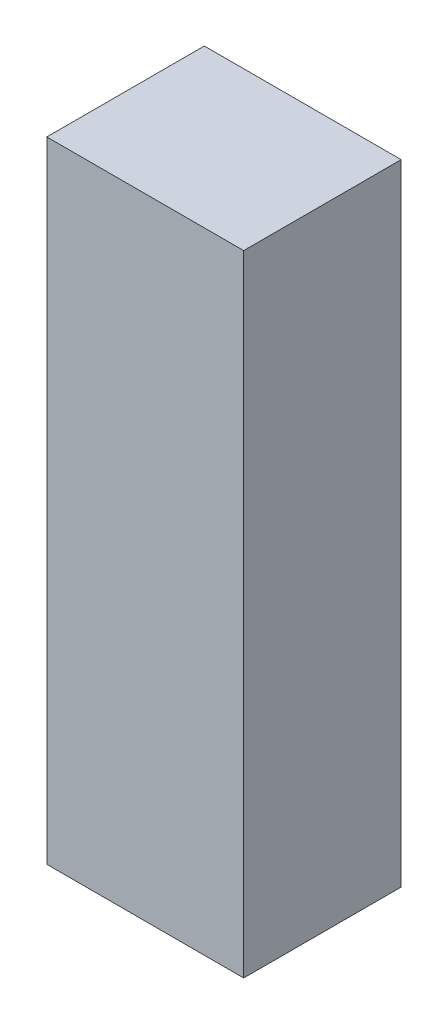
ISO-10303-21;
HEADER;
FILE_DESCRIPTION(('STEP AP214'),'2;1');
FILE_NAME('part.step','',(''),(''),'','','');
FILE_SCHEMA(('AUTOMOTIVE_DESIGN { 1 0 10303 214 1 1 1 1 }'));
ENDSEC;
DATA;
#1=APPLICATION_CONTEXT('core data for automotive mechanical design processes');
#2=APPLICATION_PROTOCOL_DEFINITION('international standard','automotive_design',2000,#1);
#3=PRODUCT_CONTEXT('',#1,'mechanical');
#4=PRODUCT('Part','Part','',(#3));
#5=PRODUCT_RELATED_PRODUCT_CATEGORY('part','',(#4));
#6=PRODUCT_DEFINITION_FORMATION('','',#4);
#7=PRODUCT_DEFINITION_CONTEXT('part definition',#1,'design');
#8=PRODUCT_DEFINITION('design','',#6,#7);
#9=PRODUCT_DEFINITION_SHAPE('','',#8);
#10=(LENGTH_UNIT() NAMED_UNIT(*) SI_UNIT(.MILLI.,.METRE.));
#11=(NAMED_UNIT(*) PLANE_ANGLE_UNIT() SI_UNIT($,.RADIAN.));
#12=(NAMED_UNIT(*) SI_UNIT($,.STERADIAN.) SOLID_ANGLE_UNIT());
#13=UNCERTAINTY_MEASURE_WITH_UNIT(LENGTH_MEASURE(1.E-05),#10,'distance_accuracy_value','');
#14=(GEOMETRIC_REPRESENTATION_CONTEXT(3) GLOBAL_UNCERTAINTY_ASSIGNED_CONTEXT((#13)) GLOBAL_UNIT_ASSIGNED_CONTEXT((#10,
#11,#12)) REPRESENTATION_CONTEXT('',''));
#15=CARTESIAN_POINT('',(0.,0.,0.));
#16=DIRECTION('',(0.,0.,1.));
#17=DIRECTION('',(1.,0.,0.));
#18=AXIS2_PLACEMENT_3D('',#15,#16,#17);
#19=CARTESIAN_POINT('',(0.,0.,0.2));
#20=DIRECTION('',(0.,1.,0.));
#21=DIRECTION('',(0.,0.,1.));
#22=AXIS2_PLACEMENT_3D('',#19,#20,#21);
#23=PLANE('',#22);
#24=DIRECTION('',(1.,0.,0.));
#25=VECTOR('',#24,1.);
#26=CARTESIAN_POINT('',(0.,0.,0.));
#27=LINE('',#26,#25);
#28=CARTESIAN_POINT('',(0.,0.,0.));
#29=VERTEX_POINT('',#28);
#30=CARTESIAN_POINT('',(0.25,0.,0.));
#31=VERTEX_POINT('',#30);
#32=EDGE_CURVE('E97',#29,#31,#27,.T.);
#33=ORIENTED_EDGE('',*,*,#32,.T.);
#34=DIRECTION('',(0.,0.,-1.));
#35=VECTOR('',#34,1.);
#36=CARTESIAN_POINT('',(0.25,0.,0.2));
#37=LINE('',#36,#35);
#38=CARTESIAN_POINT('',(0.25,0.,0.2));
#39=VERTEX_POINT('',#38);
#40=EDGE_CURVE('E11',#39,#31,#37,.T.);
#41=ORIENTED_EDGE('',*,*,#40,.F.);
#42=DIRECTION('',(1.,0.,0.));
#43=VECTOR('',#42,1.);
#44=CARTESIAN_POINT('',(0.,0.,0.2));
#45=LINE('',#44,#43);
#46=CARTESIAN_POINT('',(0.,0.,0.2));
#47=VERTEX_POINT('',#46);
#48=EDGE_CURVE('E83',#47,#39,#45,.T.);
#49=ORIENTED_EDGE('',*,*,#48,.F.);
#50=DIRECTION('',(0.,0.,-1.));
#51=VECTOR('',#50,1.);
#52=CARTESIAN_POINT('',(0.,0.,0.2));
#53=LINE('',#52,#51);
#54=EDGE_CURVE('E50',#47,#29,#53,.T.);
#55=ORIENTED_EDGE('',*,*,#54,.T.);
#56=EDGE_LOOP('',(#33,#41,#49,#55));
#57=FACE_BOUND('',#56,.T.);
#58=ADVANCED_FACE('F34',(#57),#23,.F.);
#59=CARTESIAN_POINT('',(0.25,0.,0.2));
#60=DIRECTION('',(-1.,0.,0.));
#61=DIRECTION('',(0.,0.,1.));
#62=AXIS2_PLACEMENT_3D('',#59,#60,#61);
#63=PLANE('',#62);
#64=DIRECTION('',(0.,1.,0.));
#65=VECTOR('',#64,1.);
#66=CARTESIAN_POINT('',(0.25,0.,0.));
#67=LINE('',#66,#65);
#68=CARTESIAN_POINT('',(0.25,0.8,0.));
#69=VERTEX_POINT('',#68);
#70=EDGE_CURVE('E88',#31,#69,#67,.T.);
#71=ORIENTED_EDGE('',*,*,#70,.T.);
#72=DIRECTION('',(0.,0.,-1.));
#73=VECTOR('',#72,1.);
#74=CARTESIAN_POINT('',(0.25,0.8,0.2));
#75=LINE('',#74,#73);
#76=CARTESIAN_POINT('',(0.25,0.8,0.2));
#77=VERTEX_POINT('',#76);
#78=EDGE_CURVE('E42',#77,#69,#75,.T.);
#79=ORIENTED_EDGE('',*,*,#78,.F.);
#80=DIRECTION('',(0.,1.,0.));
#81=VECTOR('',#80,1.);
#82=CARTESIAN_POINT('',(0.25,0.,0.2));
#83=LINE('',#82,#81);
#84=EDGE_CURVE('E75',#39,#77,#83,.T.);
#85=ORIENTED_EDGE('',*,*,#84,.F.);
#86=ORIENTED_EDGE('',*,*,#40,.T.);
#87=EDGE_LOOP('',(#71,#79,#85,#86));
#88=FACE_BOUND('',#87,.T.);
#89=ADVANCED_FACE('F87',(#88),#63,.F.);
#90=CARTESIAN_POINT('',(0.,0.8,0.2));
#91=DIRECTION('',(0.,1.,0.));
#92=DIRECTION('',(0.,0.,1.));
#93=AXIS2_PLACEMENT_3D('',#90,#91,#92);
#94=PLANE('',#93);
#95=DIRECTION('',(1.,0.,0.));
#96=VECTOR('',#95,1.);
#97=CARTESIAN_POINT('',(0.,0.8,0.));
#98=LINE('',#97,#96);
#99=CARTESIAN_POINT('',(0.,0.8,0.));
#100=VERTEX_POINT('',#99);
#101=EDGE_CURVE('E100',#100,#69,#98,.T.);
#102=ORIENTED_EDGE('',*,*,#101,.F.);
#103=DIRECTION('',(0.,0.,-1.));
#104=VECTOR('',#103,1.);
#105=CARTESIAN_POINT('',(0.,0.8,0.2));
#106=LINE('',#105,#104);
#107=CARTESIAN_POINT('',(0.,0.8,0.2));
#108=VERTEX_POINT('',#107);
#109=EDGE_CURVE('E64',#108,#100,#106,.T.);
#110=ORIENTED_EDGE('',*,*,#109,.F.);
#111=DIRECTION('',(1.,0.,0.));
#112=VECTOR('',#111,1.);
#113=CARTESIAN_POINT('',(0.,0.8,0.2));
#114=LINE('',#113,#112);
#115=EDGE_CURVE('E82',#108,#77,#114,.T.);
#116=ORIENTED_EDGE('',*,*,#115,.T.);
#117=ORIENTED_EDGE('',*,*,#78,.T.);
#118=EDGE_LOOP('',(#102,#110,#116,#117));
#119=FACE_BOUND('',#118,.T.);
#120=ADVANCED_FACE('F91',(#119),#94,.T.);
#121=CARTESIAN_POINT('',(0.,0.,0.2));
#122=DIRECTION('',(-1.,0.,0.));
#123=DIRECTION('',(0.,0.,1.));
#124=AXIS2_PLACEMENT_3D('',#121,#122,#123);
#125=PLANE('',#124);
#126=DIRECTION('',(0.,1.,0.));
#127=VECTOR('',#126,1.);
#128=CARTESIAN_POINT('',(0.,0.,0.));
#129=LINE('',#128,#127);
#130=EDGE_CURVE('E102',#29,#100,#129,.T.);
#131=ORIENTED_EDGE('',*,*,#130,.F.);
#132=ORIENTED_EDGE('',*,*,#54,.F.);
#133=DIRECTION('',(0.,1.,0.));
#134=VECTOR('',#133,1.);
#135=CARTESIAN_POINT('',(0.,0.,0.2));
#136=LINE('',#135,#134);
#137=EDGE_CURVE('E92',#47,#108,#136,.T.);
#138=ORIENTED_EDGE('',*,*,#137,.T.);
#139=ORIENTED_EDGE('',*,*,#109,.T.);
#140=EDGE_LOOP('',(#131,#132,#138,#139));
#141=FACE_BOUND('',#140,.T.);
#142=ADVANCED_FACE('F108',(#141),#125,.T.);
#143=CARTESIAN_POINT('',(0.,0.,0.2));
#144=DIRECTION('',(0.,0.,1.));
#145=DIRECTION('',(1.,0.,0.));
#146=AXIS2_PLACEMENT_3D('',#143,#144,#145);
#147=PLANE('',#146);
#148=ORIENTED_EDGE('',*,*,#48,.T.);
#149=ORIENTED_EDGE('',*,*,#84,.T.);
#150=ORIENTED_EDGE('',*,*,#115,.F.);
#151=ORIENTED_EDGE('',*,*,#137,.F.);
#152=EDGE_LOOP('',(#148,#149,#150,#151));
#153=FACE_BOUND('',#152,.T.);
#154=ADVANCED_FACE('F79',(#153),#147,.T.);
#155=CARTESIAN_POINT('',(0.,0.,0.));
#156=DIRECTION('',(0.,0.,1.));
#157=DIRECTION('',(1.,0.,0.));
#158=AXIS2_PLACEMENT_3D('',#155,#156,#157);
#159=PLANE('',#158);
#160=ORIENTED_EDGE('',*,*,#32,.F.);
#161=ORIENTED_EDGE('',*,*,#130,.T.);
#162=ORIENTED_EDGE('',*,*,#101,.T.);
#163=ORIENTED_EDGE('',*,*,#70,.F.);
#164=EDGE_LOOP('',(#160,#161,#162,#163));
#165=FACE_BOUND('',#164,.T.);
#166=ADVANCED_FACE('F107',(#165),#159,.F.);
#167=CLOSED_SHELL('',(#58,#89,#120,#142,#154,#166));
#168=MANIFOLD_SOLID_BREP('B2',#167);
#169=ADVANCED_BREP_SHAPE_REPRESENTATION('',(#18,#168),#14);
#170=SHAPE_DEFINITION_REPRESENTATION(#9,#169);
ENDSEC;
END-ISO-10303-21;
